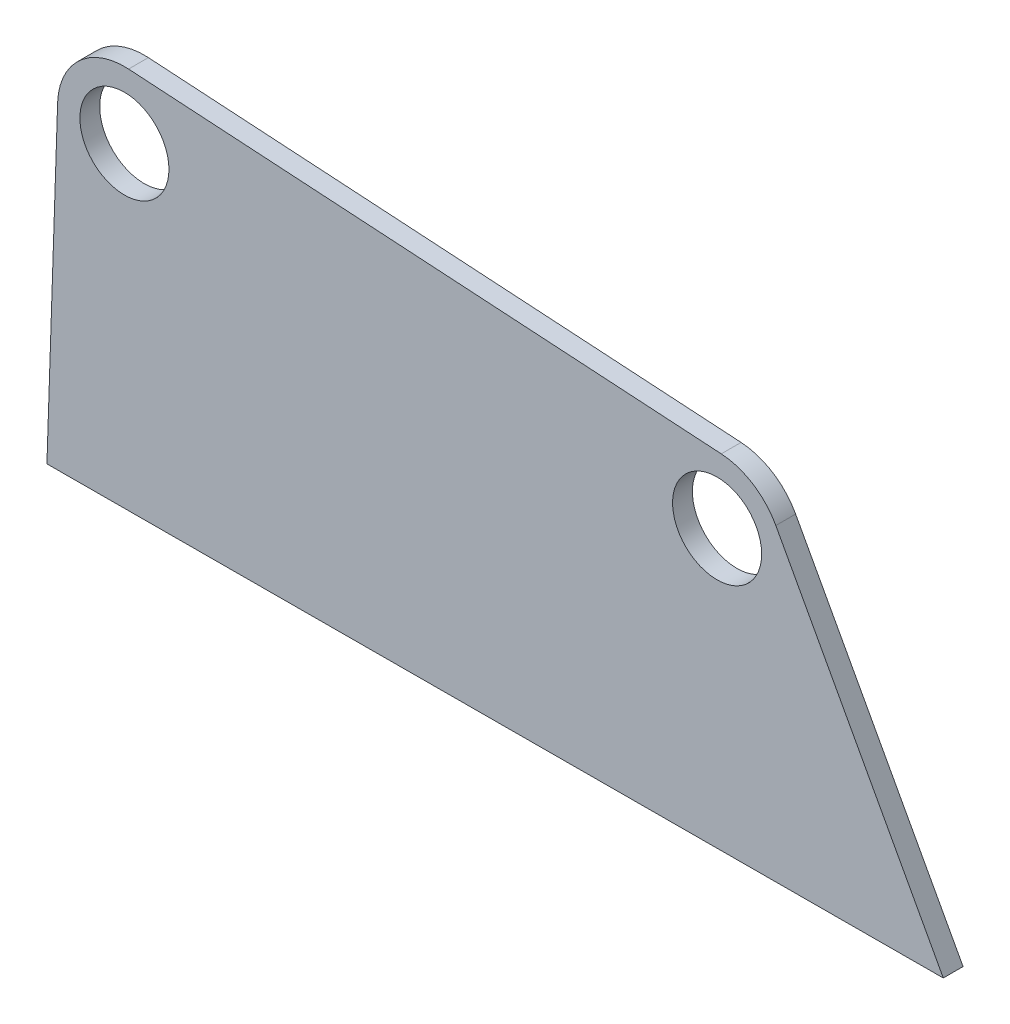
ISO-10303-21;
HEADER;
FILE_DESCRIPTION(('STEP AP214'),'2;1');
FILE_NAME('part.step','',(''),(''),'','','');
FILE_SCHEMA(('AUTOMOTIVE_DESIGN { 1 0 10303 214 1 1 1 1 }'));
ENDSEC;
DATA;
#1=APPLICATION_CONTEXT('core data for automotive mechanical design processes');
#2=APPLICATION_PROTOCOL_DEFINITION('international standard','automotive_design',2000,#1);
#3=PRODUCT_CONTEXT('',#1,'mechanical');
#4=PRODUCT('Part','Part','',(#3));
#5=PRODUCT_RELATED_PRODUCT_CATEGORY('part','',(#4));
#6=PRODUCT_DEFINITION_FORMATION('','',#4);
#7=PRODUCT_DEFINITION_CONTEXT('part definition',#1,'design');
#8=PRODUCT_DEFINITION('design','',#6,#7);
#9=PRODUCT_DEFINITION_SHAPE('','',#8);
#10=(LENGTH_UNIT() NAMED_UNIT(*) SI_UNIT(.MILLI.,.METRE.));
#11=(NAMED_UNIT(*) PLANE_ANGLE_UNIT() SI_UNIT($,.RADIAN.));
#12=(NAMED_UNIT(*) SI_UNIT($,.STERADIAN.) SOLID_ANGLE_UNIT());
#13=UNCERTAINTY_MEASURE_WITH_UNIT(LENGTH_MEASURE(1.E-05),#10,'distance_accuracy_value','');
#14=(GEOMETRIC_REPRESENTATION_CONTEXT(3) GLOBAL_UNCERTAINTY_ASSIGNED_CONTEXT((#13)) GLOBAL_UNIT_ASSIGNED_CONTEXT((#10,
#11,#12)) REPRESENTATION_CONTEXT('',''));
#15=CARTESIAN_POINT('',(0.,0.,0.));
#16=DIRECTION('',(0.,0.,1.));
#17=DIRECTION('',(1.,0.,0.));
#18=AXIS2_PLACEMENT_3D('',#15,#16,#17);
#19=CARTESIAN_POINT('',(13.925563591016,223.617790180787,3.175));
#20=DIRECTION('',(0.0621535517410026,0.998066598983243,0.));
#21=DIRECTION('',(-0.998066598983243,0.0621535517410026,0.));
#22=AXIS2_PLACEMENT_3D('',#19,#20,#21);
#23=PLANE('',#22);
#24=DIRECTION('',(0.998066598983243,-0.0621535517410026,0.));
#25=VECTOR('',#24,1.);
#26=CARTESIAN_POINT('',(13.925563591016,223.617790180787,-3.175));
#27=LINE('',#26,#25);
#28=CARTESIAN_POINT('',(143.15199643339,215.570349470762,-3.175));
#29=VERTEX_POINT('',#28);
#30=CARTESIAN_POINT('',(333.283683539698,203.730097864101,-3.175));
#31=VERTEX_POINT('',#30);
#32=EDGE_CURVE('E142',#29,#31,#27,.T.);
#33=ORIENTED_EDGE('',*,*,#32,.F.);
#34=DIRECTION('',(0.,0.,-1.));
#35=VECTOR('',#34,1.);
#36=CARTESIAN_POINT('',(143.15199643339,215.570349470762,3.175));
#37=LINE('',#36,#35);
#38=CARTESIAN_POINT('',(143.15199643339,215.570349470762,3.175));
#39=VERTEX_POINT('',#38);
#40=EDGE_CURVE('E11',#39,#29,#37,.T.);
#41=ORIENTED_EDGE('',*,*,#40,.F.);
#42=DIRECTION('',(0.998066598983243,-0.0621535517410026,0.));
#43=VECTOR('',#42,1.);
#44=CARTESIAN_POINT('',(13.925563591016,223.617790180787,3.175));
#45=LINE('',#44,#43);
#46=CARTESIAN_POINT('',(333.283683539698,203.730097864101,3.175));
#47=VERTEX_POINT('',#46);
#48=EDGE_CURVE('E167',#39,#47,#45,.T.);
#49=ORIENTED_EDGE('',*,*,#48,.T.);
#50=DIRECTION('',(0.,0.,-1.));
#51=VECTOR('',#50,1.);
#52=CARTESIAN_POINT('',(333.283683539698,203.730097864101,3.175));
#53=LINE('',#52,#51);
#54=EDGE_CURVE('E93',#47,#31,#53,.T.);
#55=ORIENTED_EDGE('',*,*,#54,.T.);
#56=EDGE_LOOP('',(#33,#41,#49,#55));
#57=FACE_BOUND('',#56,.T.);
#58=ADVANCED_FACE('F47',(#57),#23,.T.);
#59=CARTESIAN_POINT('',(141.81996812764,194.180534671303,3.175));
#60=DIRECTION('',(0.,0.,-1.));
#61=DIRECTION('',(-1.,0.,0.));
#62=AXIS2_PLACEMENT_3D('',#59,#60,#61);
#63=CYLINDRICAL_SURFACE('',#62,21.4312500000001);
#64=CARTESIAN_POINT('',(141.81996812764,194.180534671303,-3.175));
#65=DIRECTION('',(0.,0.,1.));
#66=DIRECTION('',(1.,0.,0.));
#67=AXIS2_PLACEMENT_3D('',#64,#65,#66);
#68=CIRCLE('',#67,21.4312500000001);
#69=CARTESIAN_POINT('',(120.400853613145,194.901651844464,-3.175));
#70=VERTEX_POINT('',#69);
#71=EDGE_CURVE('E146',#29,#70,#68,.T.);
#72=ORIENTED_EDGE('',*,*,#71,.T.);
#73=DIRECTION('',(0.,0.,-1.));
#74=VECTOR('',#73,1.);
#75=CARTESIAN_POINT('',(120.400853613145,194.901651844464,3.175));
#76=LINE('',#75,#74);
#77=CARTESIAN_POINT('',(120.400853613145,194.901651844464,3.175));
#78=VERTEX_POINT('',#77);
#79=EDGE_CURVE('E56',#78,#70,#76,.T.);
#80=ORIENTED_EDGE('',*,*,#79,.F.);
#81=CARTESIAN_POINT('',(141.81996812764,194.180534671303,3.175));
#82=DIRECTION('',(0.,0.,1.));
#83=DIRECTION('',(1.,0.,0.));
#84=AXIS2_PLACEMENT_3D('',#81,#82,#83);
#85=CIRCLE('',#84,21.4312500000001);
#86=EDGE_CURVE('E188',#39,#78,#85,.T.);
#87=ORIENTED_EDGE('',*,*,#86,.F.);
#88=ORIENTED_EDGE('',*,*,#40,.T.);
#89=EDGE_LOOP('',(#72,#80,#87,#88));
#90=FACE_BOUND('',#89,.T.);
#91=ADVANCED_FACE('F193',(#90),#63,.T.);
#92=CARTESIAN_POINT('',(113.710214405219,-3.82828096446189,3.175));
#93=DIRECTION('',(0.999433748124608,-0.0336479287564392,0.));
#94=DIRECTION('',(0.0336479287564392,0.999433748124608,0.));
#95=AXIS2_PLACEMENT_3D('',#92,#93,#94);
#96=PLANE('',#95);
#97=DIRECTION('',(-0.0336479287564392,-0.999433748124608,0.));
#98=VECTOR('',#97,1.);
#99=CARTESIAN_POINT('',(113.710214405219,-3.82828096446189,-3.175));
#100=LINE('',#99,#98);
#101=CARTESIAN_POINT('',(116.962765473806,92.7812110781298,-3.175));
#102=VERTEX_POINT('',#101);
#103=EDGE_CURVE('E149',#70,#102,#100,.T.);
#104=ORIENTED_EDGE('',*,*,#103,.T.);
#105=DIRECTION('',(0.,0.,-1.));
#106=VECTOR('',#105,1.);
#107=CARTESIAN_POINT('',(116.962765473806,92.7812110781298,3.175));
#108=LINE('',#107,#106);
#109=CARTESIAN_POINT('',(116.962765473806,92.7812110781298,3.175));
#110=VERTEX_POINT('',#109);
#111=EDGE_CURVE('E124',#110,#102,#108,.T.);
#112=ORIENTED_EDGE('',*,*,#111,.F.);
#113=DIRECTION('',(-0.0336479287564392,-0.999433748124608,0.));
#114=VECTOR('',#113,1.);
#115=CARTESIAN_POINT('',(113.710214405219,-3.82828096446189,3.175));
#116=LINE('',#115,#114);
#117=EDGE_CURVE('E113',#78,#110,#116,.T.);
#118=ORIENTED_EDGE('',*,*,#117,.F.);
#119=ORIENTED_EDGE('',*,*,#79,.T.);
#120=EDGE_LOOP('',(#104,#112,#118,#119));
#121=FACE_BOUND('',#120,.T.);
#122=ADVANCED_FACE('F178',(#121),#96,.F.);
#123=CARTESIAN_POINT('',(-0.30359503844637,92.3958965070931,3.175));
#124=DIRECTION('',(-0.00328578877472885,0.999994601781493,0.));
#125=DIRECTION('',(-0.999994601781494,-0.00328578877472885,0.));
#126=AXIS2_PLACEMENT_3D('',#123,#124,#125);
#127=PLANE('',#126);
#128=DIRECTION('',(0.999994601781494,0.00328578877472885,0.));
#129=VECTOR('',#128,1.);
#130=CARTESIAN_POINT('',(-0.30359503844637,92.3958965070931,-3.175));
#131=LINE('',#130,#129);
#132=CARTESIAN_POINT('',(404.499149114623,93.726,-3.175));
#133=VERTEX_POINT('',#132);
#134=EDGE_CURVE('E122',#102,#133,#131,.T.);
#135=ORIENTED_EDGE('',*,*,#134,.T.);
#136=DIRECTION('',(0.,0.,-1.));
#137=VECTOR('',#136,1.);
#138=CARTESIAN_POINT('',(404.499149114623,93.726,3.175));
#139=LINE('',#138,#137);
#140=CARTESIAN_POINT('',(404.499149114623,93.726,3.175));
#141=VERTEX_POINT('',#140);
#142=EDGE_CURVE('E119',#141,#133,#139,.T.);
#143=ORIENTED_EDGE('',*,*,#142,.F.);
#144=DIRECTION('',(0.999994601781494,0.00328578877472885,0.));
#145=VECTOR('',#144,1.);
#146=CARTESIAN_POINT('',(-0.30359503844637,92.3958965070931,3.175));
#147=LINE('',#146,#145);
#148=EDGE_CURVE('E106',#110,#141,#147,.T.);
#149=ORIENTED_EDGE('',*,*,#148,.F.);
#150=ORIENTED_EDGE('',*,*,#111,.T.);
#151=EDGE_LOOP('',(#135,#143,#149,#150));
#152=FACE_BOUND('',#151,.T.);
#153=ADVANCED_FACE('F120',(#152),#127,.F.);
#154=CARTESIAN_POINT('',(351.598472051144,191.070967862355,3.175));
#155=DIRECTION('',(-0.878640401948522,-0.477484077288175,0.));
#156=DIRECTION('',(0.477484077288175,-0.878640401948522,0.));
#157=AXIS2_PLACEMENT_3D('',#154,#155,#156);
#158=PLANE('',#157);
#159=DIRECTION('',(-0.477484077288175,0.878640401948522,0.));
#160=VECTOR('',#159,1.);
#161=CARTESIAN_POINT('',(351.598472051144,191.070967862355,-3.175));
#162=LINE('',#161,#160);
#163=CARTESIAN_POINT('',(350.782017348207,192.573363696024,-3.175));
#164=VERTEX_POINT('',#163);
#165=EDGE_CURVE('E86',#133,#164,#162,.T.);
#166=ORIENTED_EDGE('',*,*,#165,.T.);
#167=DIRECTION('',(0.,0.,-1.));
#168=VECTOR('',#167,1.);
#169=CARTESIAN_POINT('',(350.782017348207,192.573363696024,3.175));
#170=LINE('',#169,#168);
#171=CARTESIAN_POINT('',(350.782017348207,192.573363696024,3.175));
#172=VERTEX_POINT('',#171);
#173=EDGE_CURVE('E125',#172,#164,#170,.T.);
#174=ORIENTED_EDGE('',*,*,#173,.F.);
#175=DIRECTION('',(-0.477484077288175,0.878640401948522,0.));
#176=VECTOR('',#175,1.);
#177=CARTESIAN_POINT('',(351.598472051144,191.070967862355,3.175));
#178=LINE('',#177,#176);
#179=EDGE_CURVE('E111',#141,#172,#178,.T.);
#180=ORIENTED_EDGE('',*,*,#179,.F.);
#181=ORIENTED_EDGE('',*,*,#142,.T.);
#182=EDGE_LOOP('',(#166,#174,#180,#181));
#183=FACE_BOUND('',#182,.T.);
#184=ADVANCED_FACE('F127',(#183),#158,.F.);
#185=CARTESIAN_POINT('',(331.951655233948,182.340283064642,3.175));
#186=DIRECTION('',(0.,0.,-1.));
#187=DIRECTION('',(-1.,0.,0.));
#188=AXIS2_PLACEMENT_3D('',#185,#186,#187);
#189=CYLINDRICAL_SURFACE('',#188,14.2875);
#190=CARTESIAN_POINT('',(331.951655233948,182.340283064642,3.175));
#191=DIRECTION('',(0.,0.,1.));
#192=DIRECTION('',(1.,0.,0.));
#193=AXIS2_PLACEMENT_3D('',#190,#191,#192);
#194=CIRCLE('',#193,14.2875);
#195=CARTESIAN_POINT('',(346.239155233948,182.340283064642,3.175));
#196=VERTEX_POINT('',#195);
#197=EDGE_CURVE('E131',#196,#196,#194,.T.);
#198=ORIENTED_EDGE('',*,*,#197,.T.);
#199=EDGE_LOOP('',(#198));
#200=FACE_BOUND('',#199,.T.);
#201=CARTESIAN_POINT('',(331.951655233948,182.340283064642,-3.175));
#202=DIRECTION('',(0.,0.,1.));
#203=DIRECTION('',(1.,0.,0.));
#204=AXIS2_PLACEMENT_3D('',#201,#202,#203);
#205=CIRCLE('',#204,14.2875);
#206=CARTESIAN_POINT('',(346.239155233948,182.340283064642,-3.175));
#207=VERTEX_POINT('',#206);
#208=EDGE_CURVE('E159',#207,#207,#205,.T.);
#209=ORIENTED_EDGE('',*,*,#208,.F.);
#210=EDGE_LOOP('',(#209));
#211=FACE_BOUND('',#210,.T.);
#212=ADVANCED_FACE('F205',(#200,#211),#189,.F.);
#213=CARTESIAN_POINT('',(331.951655233948,182.340283064642,3.175));
#214=DIRECTION('',(0.,0.,-1.));
#215=DIRECTION('',(-1.,0.,0.));
#216=AXIS2_PLACEMENT_3D('',#213,#214,#215);
#217=CYLINDRICAL_SURFACE('',#216,21.43125);
#218=CARTESIAN_POINT('',(331.951655233948,182.340283064642,-3.175));
#219=DIRECTION('',(0.,0.,1.));
#220=DIRECTION('',(1.,0.,0.));
#221=AXIS2_PLACEMENT_3D('',#218,#219,#220);
#222=CIRCLE('',#221,21.43125);
#223=EDGE_CURVE('E156',#164,#31,#222,.T.);
#224=ORIENTED_EDGE('',*,*,#223,.T.);
#225=ORIENTED_EDGE('',*,*,#54,.F.);
#226=CARTESIAN_POINT('',(331.951655233948,182.340283064642,3.175));
#227=DIRECTION('',(0.,0.,1.));
#228=DIRECTION('',(1.,0.,0.));
#229=AXIS2_PLACEMENT_3D('',#226,#227,#228);
#230=CIRCLE('',#229,21.43125);
#231=EDGE_CURVE('E64',#172,#47,#230,.T.);
#232=ORIENTED_EDGE('',*,*,#231,.F.);
#233=ORIENTED_EDGE('',*,*,#173,.T.);
#234=EDGE_LOOP('',(#224,#225,#232,#233));
#235=FACE_BOUND('',#234,.T.);
#236=ADVANCED_FACE('F186',(#235),#217,.T.);
#237=CARTESIAN_POINT('',(141.81996812764,194.180534671303,3.175));
#238=DIRECTION('',(0.,0.,-1.));
#239=DIRECTION('',(-1.,0.,0.));
#240=AXIS2_PLACEMENT_3D('',#237,#238,#239);
#241=CYLINDRICAL_SURFACE('',#240,14.2874999999999);
#242=CARTESIAN_POINT('',(141.81996812764,194.180534671303,3.175));
#243=DIRECTION('',(0.,0.,1.));
#244=DIRECTION('',(1.,0.,0.));
#245=AXIS2_PLACEMENT_3D('',#242,#243,#244);
#246=CIRCLE('',#245,14.2874999999999);
#247=CARTESIAN_POINT('',(156.10746812764,194.180534671303,3.175));
#248=VERTEX_POINT('',#247);
#249=EDGE_CURVE('E138',#248,#248,#246,.T.);
#250=ORIENTED_EDGE('',*,*,#249,.T.);
#251=EDGE_LOOP('',(#250));
#252=FACE_BOUND('',#251,.T.);
#253=CARTESIAN_POINT('',(141.81996812764,194.180534671303,-3.175));
#254=DIRECTION('',(0.,0.,1.));
#255=DIRECTION('',(1.,0.,0.));
#256=AXIS2_PLACEMENT_3D('',#253,#254,#255);
#257=CIRCLE('',#256,14.2874999999999);
#258=CARTESIAN_POINT('',(156.10746812764,194.180534671303,-3.175));
#259=VERTEX_POINT('',#258);
#260=EDGE_CURVE('E163',#259,#259,#257,.T.);
#261=ORIENTED_EDGE('',*,*,#260,.F.);
#262=EDGE_LOOP('',(#261));
#263=FACE_BOUND('',#262,.T.);
#264=ADVANCED_FACE('F208',(#252,#263),#241,.F.);
#265=CARTESIAN_POINT('',(0.,0.,3.175));
#266=DIRECTION('',(0.,0.,1.));
#267=DIRECTION('',(1.,0.,0.));
#268=AXIS2_PLACEMENT_3D('',#265,#266,#267);
#269=PLANE('',#268);
#270=ORIENTED_EDGE('',*,*,#48,.F.);
#271=ORIENTED_EDGE('',*,*,#86,.T.);
#272=ORIENTED_EDGE('',*,*,#117,.T.);
#273=ORIENTED_EDGE('',*,*,#148,.T.);
#274=ORIENTED_EDGE('',*,*,#179,.T.);
#275=ORIENTED_EDGE('',*,*,#231,.T.);
#276=EDGE_LOOP('',(#270,#271,#272,#273,#274,#275));
#277=FACE_BOUND('',#276,.T.);
#278=ORIENTED_EDGE('',*,*,#197,.F.);
#279=EDGE_LOOP('',(#278));
#280=FACE_BOUND('',#279,.T.);
#281=ORIENTED_EDGE('',*,*,#249,.F.);
#282=EDGE_LOOP('',(#281));
#283=FACE_BOUND('',#282,.T.);
#284=ADVANCED_FACE('F108',(#277,#280,#283),#269,.T.);
#285=CARTESIAN_POINT('',(0.,0.,-3.175));
#286=DIRECTION('',(0.,0.,1.));
#287=DIRECTION('',(1.,0.,0.));
#288=AXIS2_PLACEMENT_3D('',#285,#286,#287);
#289=PLANE('',#288);
#290=ORIENTED_EDGE('',*,*,#32,.T.);
#291=ORIENTED_EDGE('',*,*,#223,.F.);
#292=ORIENTED_EDGE('',*,*,#165,.F.);
#293=ORIENTED_EDGE('',*,*,#134,.F.);
#294=ORIENTED_EDGE('',*,*,#103,.F.);
#295=ORIENTED_EDGE('',*,*,#71,.F.);
#296=EDGE_LOOP('',(#290,#291,#292,#293,#294,#295));
#297=FACE_BOUND('',#296,.T.);
#298=ORIENTED_EDGE('',*,*,#208,.T.);
#299=EDGE_LOOP('',(#298));
#300=FACE_BOUND('',#299,.T.);
#301=ORIENTED_EDGE('',*,*,#260,.T.);
#302=EDGE_LOOP('',(#301));
#303=FACE_BOUND('',#302,.T.);
#304=ADVANCED_FACE('F182',(#297,#300,#303),#289,.F.);
#305=CLOSED_SHELL('',(#58,#91,#122,#153,#184,#212,#236,#264,#284,#304));
#306=MANIFOLD_SOLID_BREP('B2',#305);
#307=ADVANCED_BREP_SHAPE_REPRESENTATION('',(#18,#306),#14);
#308=SHAPE_DEFINITION_REPRESENTATION(#9,#307);
ENDSEC;
END-ISO-10303-21;
